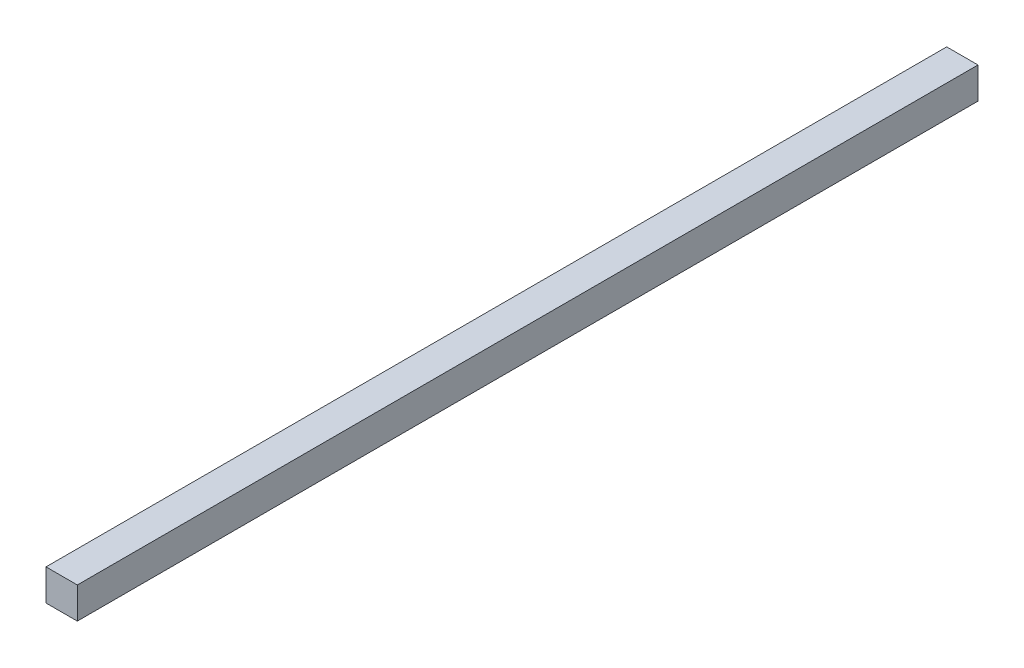
ISO-10303-21;
HEADER;
FILE_DESCRIPTION(('STEP AP214'),'2;1');
FILE_NAME('part.step','',(''),(''),'','','');
FILE_SCHEMA(('AUTOMOTIVE_DESIGN { 1 0 10303 214 1 1 1 1 }'));
ENDSEC;
DATA;
#1=APPLICATION_CONTEXT('core data for automotive mechanical design processes');
#2=APPLICATION_PROTOCOL_DEFINITION('international standard','automotive_design',2000,#1);
#3=PRODUCT_CONTEXT('',#1,'mechanical');
#4=PRODUCT('Part','Part','',(#3));
#5=PRODUCT_RELATED_PRODUCT_CATEGORY('part','',(#4));
#6=PRODUCT_DEFINITION_FORMATION('','',#4);
#7=PRODUCT_DEFINITION_CONTEXT('part definition',#1,'design');
#8=PRODUCT_DEFINITION('design','',#6,#7);
#9=PRODUCT_DEFINITION_SHAPE('','',#8);
#10=(LENGTH_UNIT() NAMED_UNIT(*) SI_UNIT(.MILLI.,.METRE.));
#11=(NAMED_UNIT(*) PLANE_ANGLE_UNIT() SI_UNIT($,.RADIAN.));
#12=(NAMED_UNIT(*) SI_UNIT($,.STERADIAN.) SOLID_ANGLE_UNIT());
#13=UNCERTAINTY_MEASURE_WITH_UNIT(LENGTH_MEASURE(1.E-05),#10,'distance_accuracy_value','');
#14=(GEOMETRIC_REPRESENTATION_CONTEXT(3) GLOBAL_UNCERTAINTY_ASSIGNED_CONTEXT((#13)) GLOBAL_UNIT_ASSIGNED_CONTEXT((#10,
#11,#12)) REPRESENTATION_CONTEXT('',''));
#15=CARTESIAN_POINT('',(0.,0.,0.));
#16=DIRECTION('',(0.,0.,1.));
#17=DIRECTION('',(1.,0.,0.));
#18=AXIS2_PLACEMENT_3D('',#15,#16,#17);
#19=CARTESIAN_POINT('',(10.,-10.,575.));
#20=DIRECTION('',(-1.,0.,0.));
#21=DIRECTION('',(0.,0.,1.));
#22=AXIS2_PLACEMENT_3D('',#19,#20,#21);
#23=PLANE('',#22);
#24=DIRECTION('',(0.,1.,0.));
#25=VECTOR('',#24,1.);
#26=CARTESIAN_POINT('',(10.,-10.,0.));
#27=LINE('',#26,#25);
#28=CARTESIAN_POINT('',(10.,-10.,0.));
#29=VERTEX_POINT('',#28);
#30=CARTESIAN_POINT('',(10.,10.,0.));
#31=VERTEX_POINT('',#30);
#32=EDGE_CURVE('E96',#29,#31,#27,.T.);
#33=ORIENTED_EDGE('',*,*,#32,.T.);
#34=DIRECTION('',(0.,0.,-1.));
#35=VECTOR('',#34,1.);
#36=CARTESIAN_POINT('',(10.,10.,575.));
#37=LINE('',#36,#35);
#38=CARTESIAN_POINT('',(10.,10.,575.));
#39=VERTEX_POINT('',#38);
#40=EDGE_CURVE('E11',#39,#31,#37,.T.);
#41=ORIENTED_EDGE('',*,*,#40,.F.);
#42=DIRECTION('',(0.,1.,0.));
#43=VECTOR('',#42,1.);
#44=CARTESIAN_POINT('',(10.,-10.,575.));
#45=LINE('',#44,#43);
#46=CARTESIAN_POINT('',(10.,-10.,575.));
#47=VERTEX_POINT('',#46);
#48=EDGE_CURVE('E84',#47,#39,#45,.T.);
#49=ORIENTED_EDGE('',*,*,#48,.F.);
#50=DIRECTION('',(0.,0.,-1.));
#51=VECTOR('',#50,1.);
#52=CARTESIAN_POINT('',(10.,-10.,575.));
#53=LINE('',#52,#51);
#54=EDGE_CURVE('E92',#47,#29,#53,.T.);
#55=ORIENTED_EDGE('',*,*,#54,.T.);
#56=EDGE_LOOP('',(#33,#41,#49,#55));
#57=FACE_BOUND('',#56,.T.);
#58=ADVANCED_FACE('F33',(#57),#23,.F.);
#59=CARTESIAN_POINT('',(-10.,10.,575.));
#60=DIRECTION('',(0.,-1.,0.));
#61=DIRECTION('',(0.,0.,-1.));
#62=AXIS2_PLACEMENT_3D('',#59,#60,#61);
#63=PLANE('',#62);
#64=DIRECTION('',(-1.,0.,0.));
#65=VECTOR('',#64,1.);
#66=CARTESIAN_POINT('',(-10.,10.,0.));
#67=LINE('',#66,#65);
#68=CARTESIAN_POINT('',(-10.,10.,0.));
#69=VERTEX_POINT('',#68);
#70=EDGE_CURVE('E88',#31,#69,#67,.T.);
#71=ORIENTED_EDGE('',*,*,#70,.T.);
#72=DIRECTION('',(0.,0.,-1.));
#73=VECTOR('',#72,1.);
#74=CARTESIAN_POINT('',(-10.,10.,575.));
#75=LINE('',#74,#73);
#76=CARTESIAN_POINT('',(-10.,10.,575.));
#77=VERTEX_POINT('',#76);
#78=EDGE_CURVE('E41',#77,#69,#75,.T.);
#79=ORIENTED_EDGE('',*,*,#78,.F.);
#80=DIRECTION('',(-1.,0.,0.));
#81=VECTOR('',#80,1.);
#82=CARTESIAN_POINT('',(-10.,10.,575.));
#83=LINE('',#82,#81);
#84=EDGE_CURVE('E79',#39,#77,#83,.T.);
#85=ORIENTED_EDGE('',*,*,#84,.F.);
#86=ORIENTED_EDGE('',*,*,#40,.T.);
#87=EDGE_LOOP('',(#71,#79,#85,#86));
#88=FACE_BOUND('',#87,.T.);
#89=ADVANCED_FACE('F87',(#88),#63,.F.);
#90=CARTESIAN_POINT('',(-10.,-10.,575.));
#91=DIRECTION('',(1.,0.,0.));
#92=DIRECTION('',(0.,0.,-1.));
#93=AXIS2_PLACEMENT_3D('',#90,#91,#92);
#94=PLANE('',#93);
#95=DIRECTION('',(0.,-1.,0.));
#96=VECTOR('',#95,1.);
#97=CARTESIAN_POINT('',(-10.,-10.,0.));
#98=LINE('',#97,#96);
#99=CARTESIAN_POINT('',(-10.,-10.,0.));
#100=VERTEX_POINT('',#99);
#101=EDGE_CURVE('E66',#69,#100,#98,.T.);
#102=ORIENTED_EDGE('',*,*,#101,.T.);
#103=DIRECTION('',(0.,0.,-1.));
#104=VECTOR('',#103,1.);
#105=CARTESIAN_POINT('',(-10.,-10.,575.));
#106=LINE('',#105,#104);
#107=CARTESIAN_POINT('',(-10.,-10.,575.));
#108=VERTEX_POINT('',#107);
#109=EDGE_CURVE('E89',#108,#100,#106,.T.);
#110=ORIENTED_EDGE('',*,*,#109,.F.);
#111=DIRECTION('',(0.,-1.,0.));
#112=VECTOR('',#111,1.);
#113=CARTESIAN_POINT('',(-10.,-10.,575.));
#114=LINE('',#113,#112);
#115=EDGE_CURVE('E82',#77,#108,#114,.T.);
#116=ORIENTED_EDGE('',*,*,#115,.F.);
#117=ORIENTED_EDGE('',*,*,#78,.T.);
#118=EDGE_LOOP('',(#102,#110,#116,#117));
#119=FACE_BOUND('',#118,.T.);
#120=ADVANCED_FACE('F90',(#119),#94,.F.);
#121=CARTESIAN_POINT('',(-10.,-10.,575.));
#122=DIRECTION('',(0.,1.,0.));
#123=DIRECTION('',(0.,0.,1.));
#124=AXIS2_PLACEMENT_3D('',#121,#122,#123);
#125=PLANE('',#124);
#126=DIRECTION('',(1.,0.,0.));
#127=VECTOR('',#126,1.);
#128=CARTESIAN_POINT('',(-10.,-10.,0.));
#129=LINE('',#128,#127);
#130=EDGE_CURVE('E72',#100,#29,#129,.T.);
#131=ORIENTED_EDGE('',*,*,#130,.T.);
#132=ORIENTED_EDGE('',*,*,#54,.F.);
#133=DIRECTION('',(1.,0.,0.));
#134=VECTOR('',#133,1.);
#135=CARTESIAN_POINT('',(-10.,-10.,575.));
#136=LINE('',#135,#134);
#137=EDGE_CURVE('E49',#108,#47,#136,.T.);
#138=ORIENTED_EDGE('',*,*,#137,.F.);
#139=ORIENTED_EDGE('',*,*,#109,.T.);
#140=EDGE_LOOP('',(#131,#132,#138,#139));
#141=FACE_BOUND('',#140,.T.);
#142=ADVANCED_FACE('F103',(#141),#125,.F.);
#143=CARTESIAN_POINT('',(0.,0.,575.));
#144=DIRECTION('',(0.,0.,-1.));
#145=DIRECTION('',(-1.,0.,0.));
#146=AXIS2_PLACEMENT_3D('',#143,#144,#145);
#147=PLANE('',#146);
#148=ORIENTED_EDGE('',*,*,#48,.T.);
#149=ORIENTED_EDGE('',*,*,#84,.T.);
#150=ORIENTED_EDGE('',*,*,#115,.T.);
#151=ORIENTED_EDGE('',*,*,#137,.T.);
#152=EDGE_LOOP('',(#148,#149,#150,#151));
#153=FACE_BOUND('',#152,.T.);
#154=ADVANCED_FACE('F80',(#153),#147,.F.);
#155=CARTESIAN_POINT('',(0.,0.,0.));
#156=DIRECTION('',(0.,0.,-1.));
#157=DIRECTION('',(-1.,0.,0.));
#158=AXIS2_PLACEMENT_3D('',#155,#156,#157);
#159=PLANE('',#158);
#160=ORIENTED_EDGE('',*,*,#32,.F.);
#161=ORIENTED_EDGE('',*,*,#130,.F.);
#162=ORIENTED_EDGE('',*,*,#101,.F.);
#163=ORIENTED_EDGE('',*,*,#70,.F.);
#164=EDGE_LOOP('',(#160,#161,#162,#163));
#165=FACE_BOUND('',#164,.T.);
#166=ADVANCED_FACE('F106',(#165),#159,.T.);
#167=CLOSED_SHELL('',(#58,#89,#120,#142,#154,#166));
#168=MANIFOLD_SOLID_BREP('B2',#167);
#169=ADVANCED_BREP_SHAPE_REPRESENTATION('',(#18,#168),#14);
#170=SHAPE_DEFINITION_REPRESENTATION(#9,#169);
ENDSEC;
END-ISO-10303-21;
